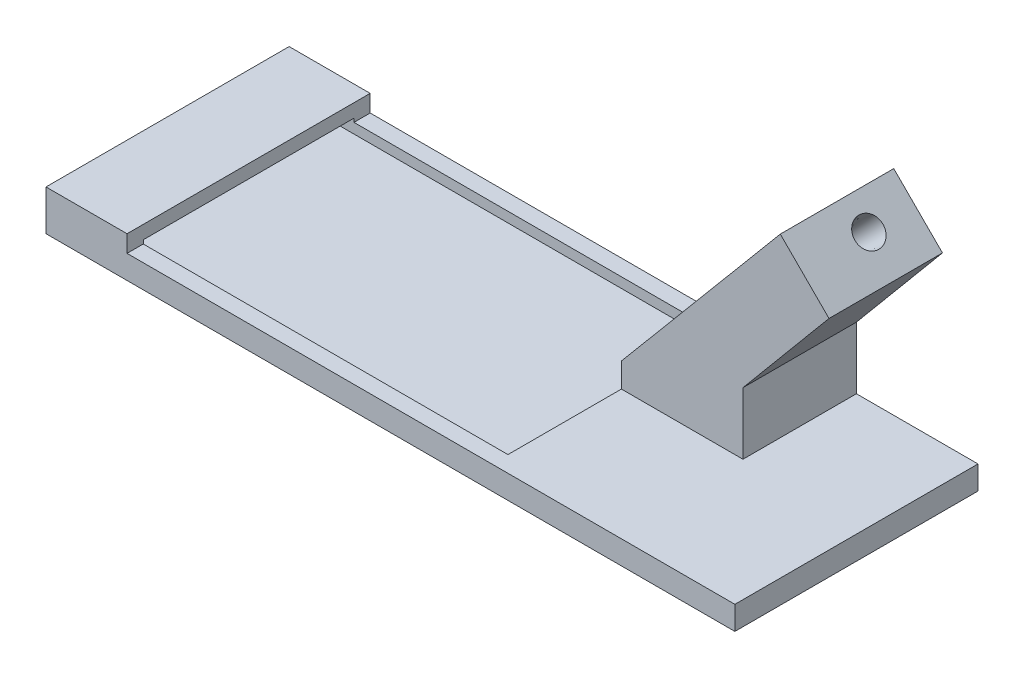
ISO-10303-21;
HEADER;
FILE_DESCRIPTION(('STEP AP214'),'2;1');
FILE_NAME('part.step','',(''),(''),'','','');
FILE_SCHEMA(('AUTOMOTIVE_DESIGN { 1 0 10303 214 1 1 1 1 }'));
ENDSEC;
DATA;
#1=APPLICATION_CONTEXT('core data for automotive mechanical design processes');
#2=APPLICATION_PROTOCOL_DEFINITION('international standard','automotive_design',2000,#1);
#3=PRODUCT_CONTEXT('',#1,'mechanical');
#4=PRODUCT('Part','Part','',(#3));
#5=PRODUCT_RELATED_PRODUCT_CATEGORY('part','',(#4));
#6=PRODUCT_DEFINITION_FORMATION('','',#4);
#7=PRODUCT_DEFINITION_CONTEXT('part definition',#1,'design');
#8=PRODUCT_DEFINITION('design','',#6,#7);
#9=PRODUCT_DEFINITION_SHAPE('','',#8);
#10=(LENGTH_UNIT() NAMED_UNIT(*) SI_UNIT(.MILLI.,.METRE.));
#11=(NAMED_UNIT(*) PLANE_ANGLE_UNIT() SI_UNIT($,.RADIAN.));
#12=(NAMED_UNIT(*) SI_UNIT($,.STERADIAN.) SOLID_ANGLE_UNIT());
#13=UNCERTAINTY_MEASURE_WITH_UNIT(LENGTH_MEASURE(1.E-05),#10,'distance_accuracy_value','');
#14=(GEOMETRIC_REPRESENTATION_CONTEXT(3) GLOBAL_UNCERTAINTY_ASSIGNED_CONTEXT((#13)) GLOBAL_UNIT_ASSIGNED_CONTEXT((#10,
#11,#12)) REPRESENTATION_CONTEXT('',''));
#15=CARTESIAN_POINT('',(0.,0.,0.));
#16=DIRECTION('',(0.,0.,1.));
#17=DIRECTION('',(1.,0.,0.));
#18=AXIS2_PLACEMENT_3D('',#15,#16,#17);
#19=CARTESIAN_POINT('',(0.,2.9,0.));
#20=DIRECTION('',(0.,-1.,0.));
#21=DIRECTION('',(0.,0.,-1.));
#22=AXIS2_PLACEMENT_3D('',#19,#20,#21);
#23=PLANE('',#22);
#24=DIRECTION('',(-1.,0.,0.));
#25=VECTOR('',#24,1.);
#26=CARTESIAN_POINT('',(12.5,2.9,-13.));
#27=LINE('',#26,#25);
#28=CARTESIAN_POINT('',(12.5,2.9,-13.));
#29=VERTEX_POINT('',#28);
#30=CARTESIAN_POINT('',(-32.5,2.9,-13.));
#31=VERTEX_POINT('',#30);
#32=EDGE_CURVE('E229',#29,#31,#27,.T.);
#33=ORIENTED_EDGE('',*,*,#32,.F.);
#34=DIRECTION('',(0.,0.,-1.));
#35=VECTOR('',#34,1.);
#36=CARTESIAN_POINT('',(12.5,2.9,0.));
#37=LINE('',#36,#35);
#38=CARTESIAN_POINT('',(12.5,2.9,-15.));
#39=VERTEX_POINT('',#38);
#40=EDGE_CURVE('E11',#29,#39,#37,.T.);
#41=ORIENTED_EDGE('',*,*,#40,.T.);
#42=DIRECTION('',(-1.,0.,0.));
#43=VECTOR('',#42,1.);
#44=CARTESIAN_POINT('',(42.5,2.9,-15.));
#45=LINE('',#44,#43);
#46=CARTESIAN_POINT('',(-32.5,2.9,-15.));
#47=VERTEX_POINT('',#46);
#48=EDGE_CURVE('E212',#39,#47,#45,.T.);
#49=ORIENTED_EDGE('',*,*,#48,.T.);
#50=DIRECTION('',(0.,0.,1.));
#51=VECTOR('',#50,1.);
#52=CARTESIAN_POINT('',(-32.5,2.9,-15.));
#53=LINE('',#52,#51);
#54=EDGE_CURVE('E215',#47,#31,#53,.T.);
#55=ORIENTED_EDGE('',*,*,#54,.T.);
#56=EDGE_LOOP('',(#33,#41,#49,#55));
#57=FACE_BOUND('',#56,.T.);
#58=ADVANCED_FACE('F32',(#57),#23,.F.);
#59=CARTESIAN_POINT('',(-42.5,5.,-15.));
#60=DIRECTION('',(1.,0.,0.));
#61=DIRECTION('',(0.,0.,-1.));
#62=AXIS2_PLACEMENT_3D('',#59,#60,#61);
#63=PLANE('',#62);
#64=DIRECTION('',(0.,0.,1.));
#65=VECTOR('',#64,1.);
#66=CARTESIAN_POINT('',(-42.5,1.65,13.));
#67=LINE('',#66,#65);
#68=CARTESIAN_POINT('',(-42.5,1.65,-13.));
#69=VERTEX_POINT('',#68);
#70=CARTESIAN_POINT('',(-42.5,1.65,13.));
#71=VERTEX_POINT('',#70);
#72=EDGE_CURVE('E250',#69,#71,#67,.T.);
#73=ORIENTED_EDGE('',*,*,#72,.F.);
#74=DIRECTION('',(0.,-1.,0.));
#75=VECTOR('',#74,1.);
#76=CARTESIAN_POINT('',(-42.5,3.35,-13.));
#77=LINE('',#76,#75);
#78=CARTESIAN_POINT('',(-42.5,3.35,-13.));
#79=VERTEX_POINT('',#78);
#80=EDGE_CURVE('E238',#79,#69,#77,.T.);
#81=ORIENTED_EDGE('',*,*,#80,.F.);
#82=DIRECTION('',(0.,0.,-1.));
#83=VECTOR('',#82,1.);
#84=CARTESIAN_POINT('',(-42.5,3.35,13.));
#85=LINE('',#84,#83);
#86=CARTESIAN_POINT('',(-42.5,3.35,13.));
#87=VERTEX_POINT('',#86);
#88=EDGE_CURVE('E242',#87,#79,#85,.T.);
#89=ORIENTED_EDGE('',*,*,#88,.F.);
#90=DIRECTION('',(0.,1.,0.));
#91=VECTOR('',#90,1.);
#92=CARTESIAN_POINT('',(-42.5,3.35,13.));
#93=LINE('',#92,#91);
#94=EDGE_CURVE('E253',#71,#87,#93,.T.);
#95=ORIENTED_EDGE('',*,*,#94,.F.);
#96=EDGE_LOOP('',(#73,#81,#89,#95));
#97=FACE_BOUND('',#96,.T.);
#98=DIRECTION('',(0.,0.,1.));
#99=VECTOR('',#98,1.);
#100=CARTESIAN_POINT('',(-42.5,0.,-15.));
#101=LINE('',#100,#99);
#102=CARTESIAN_POINT('',(-42.5,0.,-15.));
#103=VERTEX_POINT('',#102);
#104=CARTESIAN_POINT('',(-42.5,0.,15.));
#105=VERTEX_POINT('',#104);
#106=EDGE_CURVE('E260',#103,#105,#101,.T.);
#107=ORIENTED_EDGE('',*,*,#106,.T.);
#108=DIRECTION('',(0.,-1.,0.));
#109=VECTOR('',#108,1.);
#110=CARTESIAN_POINT('',(-42.5,5.,15.));
#111=LINE('',#110,#109);
#112=CARTESIAN_POINT('',(-42.5,5.,15.));
#113=VERTEX_POINT('',#112);
#114=EDGE_CURVE('E292',#113,#105,#111,.T.);
#115=ORIENTED_EDGE('',*,*,#114,.F.);
#116=DIRECTION('',(0.,0.,1.));
#117=VECTOR('',#116,1.);
#118=CARTESIAN_POINT('',(-42.5,5.,-15.));
#119=LINE('',#118,#117);
#120=CARTESIAN_POINT('',(-42.5,5.,-15.));
#121=VERTEX_POINT('',#120);
#122=EDGE_CURVE('E267',#121,#113,#119,.T.);
#123=ORIENTED_EDGE('',*,*,#122,.F.);
#124=DIRECTION('',(0.,-1.,0.));
#125=VECTOR('',#124,1.);
#126=CARTESIAN_POINT('',(-42.5,5.,-15.));
#127=LINE('',#126,#125);
#128=EDGE_CURVE('E276',#121,#103,#127,.T.);
#129=ORIENTED_EDGE('',*,*,#128,.T.);
#130=EDGE_LOOP('',(#107,#115,#123,#129));
#131=FACE_BOUND('',#130,.T.);
#132=ADVANCED_FACE('F34',(#97,#131),#63,.F.);
#133=CARTESIAN_POINT('',(42.5,5.,15.));
#134=DIRECTION('',(0.,0.,-1.));
#135=DIRECTION('',(-1.,0.,0.));
#136=AXIS2_PLACEMENT_3D('',#133,#134,#135);
#137=PLANE('',#136);
#138=DIRECTION('',(1.,0.,0.));
#139=VECTOR('',#138,1.);
#140=CARTESIAN_POINT('',(42.5,2.9,15.));
#141=LINE('',#140,#139);
#142=CARTESIAN_POINT('',(-32.5,2.9,15.));
#143=VERTEX_POINT('',#142);
#144=CARTESIAN_POINT('',(42.5,2.9,15.));
#145=VERTEX_POINT('',#144);
#146=EDGE_CURVE('E218',#143,#145,#141,.T.);
#147=ORIENTED_EDGE('',*,*,#146,.F.);
#148=DIRECTION('',(0.,1.,0.));
#149=VECTOR('',#148,1.);
#150=CARTESIAN_POINT('',(-32.5,2.9,15.));
#151=LINE('',#150,#149);
#152=CARTESIAN_POINT('',(-32.5,5.,15.));
#153=VERTEX_POINT('',#152);
#154=EDGE_CURVE('E222',#143,#153,#151,.T.);
#155=ORIENTED_EDGE('',*,*,#154,.T.);
#156=DIRECTION('',(1.,0.,0.));
#157=VECTOR('',#156,1.);
#158=CARTESIAN_POINT('',(42.5,5.,15.));
#159=LINE('',#158,#157);
#160=EDGE_CURVE('E270',#113,#153,#159,.T.);
#161=ORIENTED_EDGE('',*,*,#160,.F.);
#162=ORIENTED_EDGE('',*,*,#114,.T.);
#163=DIRECTION('',(1.,0.,0.));
#164=VECTOR('',#163,1.);
#165=CARTESIAN_POINT('',(42.5,0.,15.));
#166=LINE('',#165,#164);
#167=CARTESIAN_POINT('',(42.5,0.,15.));
#168=VERTEX_POINT('',#167);
#169=EDGE_CURVE('E279',#105,#168,#166,.T.);
#170=ORIENTED_EDGE('',*,*,#169,.T.);
#171=DIRECTION('',(0.,-1.,0.));
#172=VECTOR('',#171,1.);
#173=CARTESIAN_POINT('',(42.5,5.,15.));
#174=LINE('',#173,#172);
#175=EDGE_CURVE('E290',#145,#168,#174,.T.);
#176=ORIENTED_EDGE('',*,*,#175,.F.);
#177=EDGE_LOOP('',(#147,#155,#161,#162,#170,#176));
#178=FACE_BOUND('',#177,.T.);
#179=ADVANCED_FACE('F333',(#178),#137,.F.);
#180=CARTESIAN_POINT('',(42.5,5.,-15.));
#181=DIRECTION('',(-1.,0.,0.));
#182=DIRECTION('',(0.,0.,1.));
#183=AXIS2_PLACEMENT_3D('',#180,#181,#182);
#184=PLANE('',#183);
#185=DIRECTION('',(0.,-1.,0.));
#186=VECTOR('',#185,1.);
#187=CARTESIAN_POINT('',(42.5,5.,-15.));
#188=LINE('',#187,#186);
#189=CARTESIAN_POINT('',(42.5,2.9,-15.));
#190=VERTEX_POINT('',#189);
#191=CARTESIAN_POINT('',(42.5,0.,-15.));
#192=VERTEX_POINT('',#191);
#193=EDGE_CURVE('E288',#190,#192,#188,.T.);
#194=ORIENTED_EDGE('',*,*,#193,.F.);
#195=DIRECTION('',(0.,0.,-1.));
#196=VECTOR('',#195,1.);
#197=CARTESIAN_POINT('',(42.5,2.9,-15.));
#198=LINE('',#197,#196);
#199=EDGE_CURVE('E210',#145,#190,#198,.T.);
#200=ORIENTED_EDGE('',*,*,#199,.F.);
#201=ORIENTED_EDGE('',*,*,#175,.T.);
#202=DIRECTION('',(0.,0.,-1.));
#203=VECTOR('',#202,1.);
#204=CARTESIAN_POINT('',(42.5,0.,-15.));
#205=LINE('',#204,#203);
#206=EDGE_CURVE('E282',#168,#192,#205,.T.);
#207=ORIENTED_EDGE('',*,*,#206,.T.);
#208=EDGE_LOOP('',(#194,#200,#201,#207));
#209=FACE_BOUND('',#208,.T.);
#210=ADVANCED_FACE('F339',(#209),#184,.F.);
#211=CARTESIAN_POINT('',(42.5,5.,-15.));
#212=DIRECTION('',(0.,0.,1.));
#213=DIRECTION('',(1.,0.,0.));
#214=AXIS2_PLACEMENT_3D('',#211,#212,#213);
#215=PLANE('',#214);
#216=DIRECTION('',(-1.,0.,0.));
#217=VECTOR('',#216,1.);
#218=CARTESIAN_POINT('',(42.5,5.,-15.));
#219=LINE('',#218,#217);
#220=CARTESIAN_POINT('',(-32.5,5.,-15.));
#221=VERTEX_POINT('',#220);
#222=EDGE_CURVE('E274',#221,#121,#219,.T.);
#223=ORIENTED_EDGE('',*,*,#222,.F.);
#224=DIRECTION('',(0.,1.,0.));
#225=VECTOR('',#224,1.);
#226=CARTESIAN_POINT('',(-32.5,2.9,-15.));
#227=LINE('',#226,#225);
#228=EDGE_CURVE('E220',#47,#221,#227,.T.);
#229=ORIENTED_EDGE('',*,*,#228,.F.);
#230=ORIENTED_EDGE('',*,*,#48,.F.);
#231=DIRECTION('',(0.,1.,0.));
#232=VECTOR('',#231,1.);
#233=CARTESIAN_POINT('',(12.5,2.9,-15.));
#234=LINE('',#233,#232);
#235=CARTESIAN_POINT('',(12.5,5.9,-15.));
#236=VERTEX_POINT('',#235);
#237=EDGE_CURVE('E184',#39,#236,#234,.T.);
#238=ORIENTED_EDGE('',*,*,#237,.T.);
#239=DIRECTION('',(0.642787609686544,0.766044443118974,0.));
#240=VECTOR('',#239,1.);
#241=CARTESIAN_POINT('',(12.5,5.9,-15.));
#242=LINE('',#241,#240);
#243=CARTESIAN_POINT('',(32.1050220954396,29.2643555151287,-15.));
#244=VERTEX_POINT('',#243);
#245=EDGE_CURVE('E181',#236,#244,#242,.T.);
#246=ORIENTED_EDGE('',*,*,#245,.T.);
#247=DIRECTION('',(0.707106781186542,-0.707106781186553,0.));
#248=VECTOR('',#247,1.);
#249=CARTESIAN_POINT('',(32.1050220954396,29.2643555151287,-15.));
#250=LINE('',#249,#248);
#251=CARTESIAN_POINT('',(38.1154297355252,23.253947875043,-15.));
#252=VERTEX_POINT('',#251);
#253=EDGE_CURVE('E196',#244,#252,#250,.T.);
#254=ORIENTED_EDGE('',*,*,#253,.T.);
#255=DIRECTION('',(-0.641289531532385,-0.767298987844356,0.));
#256=VECTOR('',#255,1.);
#257=CARTESIAN_POINT('',(38.1154297355252,23.253947875043,-15.));
#258=LINE('',#257,#256);
#259=CARTESIAN_POINT('',(27.5,10.5526513605995,-15.));
#260=VERTEX_POINT('',#259);
#261=EDGE_CURVE('E161',#252,#260,#258,.T.);
#262=ORIENTED_EDGE('',*,*,#261,.T.);
#263=DIRECTION('',(0.,-1.,0.));
#264=VECTOR('',#263,1.);
#265=CARTESIAN_POINT('',(27.5,2.9,-15.));
#266=LINE('',#265,#264);
#267=CARTESIAN_POINT('',(27.5,2.9,-15.));
#268=VERTEX_POINT('',#267);
#269=EDGE_CURVE('E199',#260,#268,#266,.T.);
#270=ORIENTED_EDGE('',*,*,#269,.T.);
#271=EDGE_CURVE('E53',#190,#268,#45,.T.);
#272=ORIENTED_EDGE('',*,*,#271,.F.);
#273=ORIENTED_EDGE('',*,*,#193,.T.);
#274=DIRECTION('',(-1.,0.,0.));
#275=VECTOR('',#274,1.);
#276=CARTESIAN_POINT('',(42.5,0.,-15.));
#277=LINE('',#276,#275);
#278=EDGE_CURVE('E271',#192,#103,#277,.T.);
#279=ORIENTED_EDGE('',*,*,#278,.T.);
#280=ORIENTED_EDGE('',*,*,#128,.F.);
#281=EDGE_LOOP('',(#223,#229,#230,#238,#246,#254,#262,#270,#272,#273,#279,#280));
#282=FACE_BOUND('',#281,.T.);
#283=ADVANCED_FACE('F323',(#282),#215,.F.);
#284=CARTESIAN_POINT('',(0.,5.,0.));
#285=DIRECTION('',(0.,-1.,0.));
#286=DIRECTION('',(0.,0.,-1.));
#287=AXIS2_PLACEMENT_3D('',#284,#285,#286);
#288=PLANE('',#287);
#289=ORIENTED_EDGE('',*,*,#160,.T.);
#290=DIRECTION('',(0.,0.,1.));
#291=VECTOR('',#290,1.);
#292=CARTESIAN_POINT('',(-32.5,5.,-15.));
#293=LINE('',#292,#291);
#294=EDGE_CURVE('E205',#221,#153,#293,.T.);
#295=ORIENTED_EDGE('',*,*,#294,.F.);
#296=ORIENTED_EDGE('',*,*,#222,.T.);
#297=ORIENTED_EDGE('',*,*,#122,.T.);
#298=EDGE_LOOP('',(#289,#295,#296,#297));
#299=FACE_BOUND('',#298,.T.);
#300=ADVANCED_FACE('F328',(#299),#288,.F.);
#301=CARTESIAN_POINT('',(0.,0.,0.));
#302=DIRECTION('',(0.,-1.,0.));
#303=DIRECTION('',(0.,0.,-1.));
#304=AXIS2_PLACEMENT_3D('',#301,#302,#303);
#305=PLANE('',#304);
#306=ORIENTED_EDGE('',*,*,#106,.F.);
#307=ORIENTED_EDGE('',*,*,#278,.F.);
#308=ORIENTED_EDGE('',*,*,#206,.F.);
#309=ORIENTED_EDGE('',*,*,#169,.F.);
#310=EDGE_LOOP('',(#306,#307,#308,#309));
#311=FACE_BOUND('',#310,.T.);
#312=ADVANCED_FACE('F386',(#311),#305,.T.);
#313=CARTESIAN_POINT('',(12.5,3.35,-13.));
#314=DIRECTION('',(0.,0.,-1.));
#315=DIRECTION('',(-1.,0.,0.));
#316=AXIS2_PLACEMENT_3D('',#313,#314,#315);
#317=PLANE('',#316);
#318=ORIENTED_EDGE('',*,*,#32,.T.);
#319=DIRECTION('',(0.,1.,0.));
#320=VECTOR('',#319,1.);
#321=CARTESIAN_POINT('',(-32.5,3.35,-13.));
#322=LINE('',#321,#320);
#323=CARTESIAN_POINT('',(-32.5,3.35,-13.));
#324=VERTEX_POINT('',#323);
#325=EDGE_CURVE('E235',#31,#324,#322,.T.);
#326=ORIENTED_EDGE('',*,*,#325,.T.);
#327=DIRECTION('',(-1.,0.,0.));
#328=VECTOR('',#327,1.);
#329=CARTESIAN_POINT('',(12.5,3.35,-13.));
#330=LINE('',#329,#328);
#331=EDGE_CURVE('E258',#324,#79,#330,.T.);
#332=ORIENTED_EDGE('',*,*,#331,.T.);
#333=ORIENTED_EDGE('',*,*,#80,.T.);
#334=DIRECTION('',(-1.,0.,0.));
#335=VECTOR('',#334,1.);
#336=CARTESIAN_POINT('',(12.5,1.65,-13.));
#337=LINE('',#336,#335);
#338=CARTESIAN_POINT('',(12.5,1.65,-13.));
#339=VERTEX_POINT('',#338);
#340=EDGE_CURVE('E248',#339,#69,#337,.T.);
#341=ORIENTED_EDGE('',*,*,#340,.F.);
#342=DIRECTION('',(0.,-1.,0.));
#343=VECTOR('',#342,1.);
#344=CARTESIAN_POINT('',(12.5,3.35,-13.));
#345=LINE('',#344,#343);
#346=EDGE_CURVE('E239',#29,#339,#345,.T.);
#347=ORIENTED_EDGE('',*,*,#346,.F.);
#348=EDGE_LOOP('',(#318,#326,#332,#333,#341,#347));
#349=FACE_BOUND('',#348,.T.);
#350=ADVANCED_FACE('F314',(#349),#317,.F.);
#351=CARTESIAN_POINT('',(12.5,3.35,13.));
#352=DIRECTION('',(0.,1.,0.));
#353=DIRECTION('',(0.,0.,1.));
#354=AXIS2_PLACEMENT_3D('',#351,#352,#353);
#355=PLANE('',#354);
#356=ORIENTED_EDGE('',*,*,#331,.F.);
#357=DIRECTION('',(0.,0.,1.));
#358=VECTOR('',#357,1.);
#359=CARTESIAN_POINT('',(-32.5,3.35,13.));
#360=LINE('',#359,#358);
#361=CARTESIAN_POINT('',(-32.5,3.35,13.));
#362=VERTEX_POINT('',#361);
#363=EDGE_CURVE('E232',#324,#362,#360,.T.);
#364=ORIENTED_EDGE('',*,*,#363,.T.);
#365=DIRECTION('',(-1.,0.,0.));
#366=VECTOR('',#365,1.);
#367=CARTESIAN_POINT('',(12.5,3.35,13.));
#368=LINE('',#367,#366);
#369=EDGE_CURVE('E261',#362,#87,#368,.T.);
#370=ORIENTED_EDGE('',*,*,#369,.T.);
#371=ORIENTED_EDGE('',*,*,#88,.T.);
#372=EDGE_LOOP('',(#356,#364,#370,#371));
#373=FACE_BOUND('',#372,.T.);
#374=ADVANCED_FACE('F310',(#373),#355,.F.);
#375=CARTESIAN_POINT('',(12.5,3.35,13.));
#376=DIRECTION('',(0.,0.,1.));
#377=DIRECTION('',(1.,0.,0.));
#378=AXIS2_PLACEMENT_3D('',#375,#376,#377);
#379=PLANE('',#378);
#380=ORIENTED_EDGE('',*,*,#369,.F.);
#381=DIRECTION('',(0.,-1.,0.));
#382=VECTOR('',#381,1.);
#383=CARTESIAN_POINT('',(-32.5,3.35,13.));
#384=LINE('',#383,#382);
#385=CARTESIAN_POINT('',(-32.5,2.9,13.));
#386=VERTEX_POINT('',#385);
#387=EDGE_CURVE('E41',#362,#386,#384,.T.);
#388=ORIENTED_EDGE('',*,*,#387,.T.);
#389=DIRECTION('',(1.,0.,0.));
#390=VECTOR('',#389,1.);
#391=CARTESIAN_POINT('',(12.5,2.9,13.));
#392=LINE('',#391,#390);
#393=CARTESIAN_POINT('',(12.5,2.9,13.));
#394=VERTEX_POINT('',#393);
#395=EDGE_CURVE('E225',#386,#394,#392,.T.);
#396=ORIENTED_EDGE('',*,*,#395,.T.);
#397=DIRECTION('',(0.,1.,0.));
#398=VECTOR('',#397,1.);
#399=CARTESIAN_POINT('',(12.5,3.35,13.));
#400=LINE('',#399,#398);
#401=CARTESIAN_POINT('',(12.5,1.65,13.));
#402=VERTEX_POINT('',#401);
#403=EDGE_CURVE('E245',#402,#394,#400,.T.);
#404=ORIENTED_EDGE('',*,*,#403,.F.);
#405=DIRECTION('',(-1.,0.,0.));
#406=VECTOR('',#405,1.);
#407=CARTESIAN_POINT('',(12.5,1.65,13.));
#408=LINE('',#407,#406);
#409=EDGE_CURVE('E263',#402,#71,#408,.T.);
#410=ORIENTED_EDGE('',*,*,#409,.T.);
#411=ORIENTED_EDGE('',*,*,#94,.T.);
#412=EDGE_LOOP('',(#380,#388,#396,#404,#410,#411));
#413=FACE_BOUND('',#412,.T.);
#414=ADVANCED_FACE('F301',(#413),#379,.F.);
#415=CARTESIAN_POINT('',(12.5,1.65,13.));
#416=DIRECTION('',(0.,-1.,0.));
#417=DIRECTION('',(0.,0.,-1.));
#418=AXIS2_PLACEMENT_3D('',#415,#416,#417);
#419=PLANE('',#418);
#420=ORIENTED_EDGE('',*,*,#72,.T.);
#421=ORIENTED_EDGE('',*,*,#409,.F.);
#422=DIRECTION('',(0.,0.,1.));
#423=VECTOR('',#422,1.);
#424=CARTESIAN_POINT('',(12.5,1.65,13.));
#425=LINE('',#424,#423);
#426=EDGE_CURVE('E241',#339,#402,#425,.T.);
#427=ORIENTED_EDGE('',*,*,#426,.F.);
#428=ORIENTED_EDGE('',*,*,#340,.T.);
#429=EDGE_LOOP('',(#420,#421,#427,#428));
#430=FACE_BOUND('',#429,.T.);
#431=ADVANCED_FACE('F373',(#430),#419,.F.);
#432=CARTESIAN_POINT('',(12.5,0.,0.));
#433=DIRECTION('',(1.,0.,0.));
#434=DIRECTION('',(0.,0.,-1.));
#435=AXIS2_PLACEMENT_3D('',#432,#433,#434);
#436=PLANE('',#435);
#437=CARTESIAN_POINT('',(12.5,4.43197982829525,-9.20586955342873));
#438=DIRECTION('',(1.,0.,0.));
#439=DIRECTION('',(0.,0.999991298408043,-0.00417170327266018));
#440=AXIS2_PLACEMENT_3D('',#437,#438,#439);
#441=ELLIPSE('',#440,0.94280815882055,0.666279510135949);
#442=CARTESIAN_POINT('',(12.5,5.37477978318391,-9.20980266931037));
#443=VERTEX_POINT('',#442);
#444=EDGE_CURVE('E187',#443,#443,#441,.F.);
#445=ORIENTED_EDGE('',*,*,#444,.F.);
#446=EDGE_LOOP('',(#445));
#447=FACE_BOUND('',#446,.T.);
#448=ORIENTED_EDGE('',*,*,#403,.T.);
#449=DIRECTION('',(0.,0.,-1.));
#450=VECTOR('',#449,1.);
#451=CARTESIAN_POINT('',(12.5,2.9,0.));
#452=LINE('',#451,#450);
#453=CARTESIAN_POINT('',(12.5,2.9,-0.999999999999995));
#454=VERTEX_POINT('',#453);
#455=EDGE_CURVE('E295',#394,#454,#452,.T.);
#456=ORIENTED_EDGE('',*,*,#455,.T.);
#457=DIRECTION('',(0.,1.,0.));
#458=VECTOR('',#457,1.);
#459=CARTESIAN_POINT('',(12.5,2.9,-0.999999999999992));
#460=LINE('',#459,#458);
#461=CARTESIAN_POINT('',(12.5,5.9,-0.999999999999992));
#462=VERTEX_POINT('',#461);
#463=EDGE_CURVE('E192',#454,#462,#460,.T.);
#464=ORIENTED_EDGE('',*,*,#463,.T.);
#465=DIRECTION('',(0.,0.,-1.));
#466=VECTOR('',#465,1.);
#467=CARTESIAN_POINT('',(12.5,5.9,-0.999999999999992));
#468=LINE('',#467,#466);
#469=EDGE_CURVE('E206',#462,#236,#468,.T.);
#470=ORIENTED_EDGE('',*,*,#469,.T.);
#471=ORIENTED_EDGE('',*,*,#237,.F.);
#472=ORIENTED_EDGE('',*,*,#40,.F.);
#473=ORIENTED_EDGE('',*,*,#346,.T.);
#474=ORIENTED_EDGE('',*,*,#426,.T.);
#475=EDGE_LOOP('',(#448,#456,#464,#470,#471,#472,#473,#474));
#476=FACE_BOUND('',#475,.T.);
#477=ADVANCED_FACE('F369',(#447,#476),#436,.F.);
#478=CARTESIAN_POINT('',(-32.5,2.9,-15.));
#479=DIRECTION('',(-1.,0.,0.));
#480=DIRECTION('',(0.,0.,1.));
#481=AXIS2_PLACEMENT_3D('',#478,#479,#480);
#482=PLANE('',#481);
#483=ORIENTED_EDGE('',*,*,#54,.F.);
#484=ORIENTED_EDGE('',*,*,#228,.T.);
#485=ORIENTED_EDGE('',*,*,#294,.T.);
#486=ORIENTED_EDGE('',*,*,#154,.F.);
#487=EDGE_CURVE('E214',#386,#143,#53,.T.);
#488=ORIENTED_EDGE('',*,*,#487,.F.);
#489=ORIENTED_EDGE('',*,*,#387,.F.);
#490=ORIENTED_EDGE('',*,*,#363,.F.);
#491=ORIENTED_EDGE('',*,*,#325,.F.);
#492=EDGE_LOOP('',(#483,#484,#485,#486,#488,#489,#490,#491));
#493=FACE_BOUND('',#492,.T.);
#494=ADVANCED_FACE('F306',(#493),#482,.F.);
#495=ORIENTED_EDGE('',*,*,#271,.T.);
#496=DIRECTION('',(0.,0.,-1.));
#497=VECTOR('',#496,1.);
#498=CARTESIAN_POINT('',(27.5,2.9,-0.999999999999994));
#499=LINE('',#498,#497);
#500=CARTESIAN_POINT('',(27.5,2.9,-0.999999999999996));
#501=VERTEX_POINT('',#500);
#502=EDGE_CURVE('E48',#501,#268,#499,.T.);
#503=ORIENTED_EDGE('',*,*,#502,.F.);
#504=DIRECTION('',(-1.,0.,0.));
#505=VECTOR('',#504,1.);
#506=CARTESIAN_POINT('',(27.5,2.9,-0.999999999999994));
#507=LINE('',#506,#505);
#508=EDGE_CURVE('E190',#501,#454,#507,.T.);
#509=ORIENTED_EDGE('',*,*,#508,.T.);
#510=ORIENTED_EDGE('',*,*,#455,.F.);
#511=ORIENTED_EDGE('',*,*,#395,.F.);
#512=ORIENTED_EDGE('',*,*,#487,.T.);
#513=ORIENTED_EDGE('',*,*,#146,.T.);
#514=ORIENTED_EDGE('',*,*,#199,.T.);
#515=EDGE_LOOP('',(#495,#503,#509,#510,#511,#512,#513,#514));
#516=FACE_BOUND('',#515,.T.);
#517=ADVANCED_FACE('F336',(#516),#23,.F.);
#518=CARTESIAN_POINT('',(32.1050220954396,29.2643555151287,-0.999999999999994));
#519=DIRECTION('',(0.707106781186553,0.707106781186542,0.));
#520=DIRECTION('',(-0.707106781186542,0.707106781186553,0.));
#521=AXIS2_PLACEMENT_3D('',#518,#519,#520);
#522=PLANE('',#521);
#523=CARTESIAN_POINT('',(34.7346888052843,26.634688805284,-9.29866682501442));
#524=DIRECTION('',(0.707106781186553,0.707106781186542,0.));
#525=DIRECTION('',(-5.58935636202951E-13,5.58813185134068E-13,-1.));
#526=AXIS2_PLACEMENT_3D('',#523,#524,#525);
#527=ELLIPSE('',#526,1.7325015888044,1.73249404232161);
#528=CARTESIAN_POINT('',(34.7346888052833,26.634688805285,-11.0311684138188));
#529=VERTEX_POINT('',#528);
#530=EDGE_CURVE('E36',#529,#529,#527,.F.);
#531=ORIENTED_EDGE('',*,*,#530,.T.);
#532=EDGE_LOOP('',(#531));
#533=FACE_BOUND('',#532,.T.);
#534=ORIENTED_EDGE('',*,*,#253,.F.);
#535=DIRECTION('',(0.,0.,-1.));
#536=VECTOR('',#535,1.);
#537=CARTESIAN_POINT('',(32.1050220954396,29.2643555151287,-0.999999999999994));
#538=LINE('',#537,#536);
#539=CARTESIAN_POINT('',(32.1050220954396,29.2643555151287,-0.999999999999994));
#540=VERTEX_POINT('',#539);
#541=EDGE_CURVE('E180',#540,#244,#538,.T.);
#542=ORIENTED_EDGE('',*,*,#541,.F.);
#543=DIRECTION('',(0.707106781186542,-0.707106781186553,0.));
#544=VECTOR('',#543,1.);
#545=CARTESIAN_POINT('',(32.1050220954396,29.2643555151287,-0.999999999999994));
#546=LINE('',#545,#544);
#547=CARTESIAN_POINT('',(38.1154297355252,23.253947875043,-0.999999999999996));
#548=VERTEX_POINT('',#547);
#549=EDGE_CURVE('E174',#540,#548,#546,.T.);
#550=ORIENTED_EDGE('',*,*,#549,.T.);
#551=DIRECTION('',(0.,0.,-1.));
#552=VECTOR('',#551,1.);
#553=CARTESIAN_POINT('',(38.1154297355252,23.253947875043,-0.999999999999996));
#554=LINE('',#553,#552);
#555=EDGE_CURVE('E156',#548,#252,#554,.T.);
#556=ORIENTED_EDGE('',*,*,#555,.T.);
#557=EDGE_LOOP('',(#534,#542,#550,#556));
#558=FACE_BOUND('',#557,.T.);
#559=ADVANCED_FACE('F179',(#533,#558),#522,.T.);
#560=CARTESIAN_POINT('',(12.5,5.9,-0.999999999999992));
#561=DIRECTION('',(-0.766044443118974,0.642787609686544,0.));
#562=DIRECTION('',(-0.642787609686544,-0.766044443118974,0.));
#563=AXIS2_PLACEMENT_3D('',#560,#561,#562);
#564=PLANE('',#563);
#565=ORIENTED_EDGE('',*,*,#245,.F.);
#566=ORIENTED_EDGE('',*,*,#469,.F.);
#567=DIRECTION('',(0.642787609686544,0.766044443118974,0.));
#568=VECTOR('',#567,1.);
#569=CARTESIAN_POINT('',(12.5,5.9,-0.999999999999992));
#570=LINE('',#569,#568);
#571=EDGE_CURVE('E167',#462,#540,#570,.T.);
#572=ORIENTED_EDGE('',*,*,#571,.T.);
#573=ORIENTED_EDGE('',*,*,#541,.T.);
#574=EDGE_LOOP('',(#565,#566,#572,#573));
#575=FACE_BOUND('',#574,.T.);
#576=ADVANCED_FACE('F346',(#575),#564,.T.);
#577=CARTESIAN_POINT('',(27.5,2.9,-0.999999999999994));
#578=DIRECTION('',(1.,0.,0.));
#579=DIRECTION('',(0.,0.,-1.));
#580=AXIS2_PLACEMENT_3D('',#577,#578,#579);
#581=PLANE('',#580);
#582=ORIENTED_EDGE('',*,*,#269,.F.);
#583=DIRECTION('',(0.,0.,-1.));
#584=VECTOR('',#583,1.);
#585=CARTESIAN_POINT('',(27.5,10.5526513605995,-0.999999999999994));
#586=LINE('',#585,#584);
#587=CARTESIAN_POINT('',(27.5,10.5526513605995,-0.999999999999994));
#588=VERTEX_POINT('',#587);
#589=EDGE_CURVE('E166',#588,#260,#586,.T.);
#590=ORIENTED_EDGE('',*,*,#589,.F.);
#591=DIRECTION('',(0.,-1.,0.));
#592=VECTOR('',#591,1.);
#593=CARTESIAN_POINT('',(27.5,2.9,-0.999999999999994));
#594=LINE('',#593,#592);
#595=EDGE_CURVE('E177',#588,#501,#594,.T.);
#596=ORIENTED_EDGE('',*,*,#595,.T.);
#597=ORIENTED_EDGE('',*,*,#502,.T.);
#598=EDGE_LOOP('',(#582,#590,#596,#597));
#599=FACE_BOUND('',#598,.T.);
#600=ADVANCED_FACE('F344',(#599),#581,.T.);
#601=CARTESIAN_POINT('',(38.1154297355252,23.253947875043,-0.999999999999996));
#602=DIRECTION('',(0.767298987844356,-0.641289531532386,0.));
#603=DIRECTION('',(0.641289531532386,0.767298987844356,0.));
#604=AXIS2_PLACEMENT_3D('',#601,#602,#603);
#605=PLANE('',#604);
#606=ORIENTED_EDGE('',*,*,#261,.F.);
#607=ORIENTED_EDGE('',*,*,#555,.F.);
#608=DIRECTION('',(-0.641289531532385,-0.767298987844356,0.));
#609=VECTOR('',#608,1.);
#610=CARTESIAN_POINT('',(38.1154297355252,23.253947875043,-0.999999999999996));
#611=LINE('',#610,#609);
#612=EDGE_CURVE('E159',#548,#588,#611,.T.);
#613=ORIENTED_EDGE('',*,*,#612,.T.);
#614=ORIENTED_EDGE('',*,*,#589,.T.);
#615=EDGE_LOOP('',(#606,#607,#613,#614));
#616=FACE_BOUND('',#615,.T.);
#617=ADVANCED_FACE('F158',(#616),#605,.T.);
#618=CARTESIAN_POINT('',(0.,0.,-0.99999999999999));
#619=DIRECTION('',(0.,0.,1.));
#620=DIRECTION('',(1.,0.,0.));
#621=AXIS2_PLACEMENT_3D('',#618,#619,#620);
#622=PLANE('',#621);
#623=ORIENTED_EDGE('',*,*,#549,.F.);
#624=ORIENTED_EDGE('',*,*,#571,.F.);
#625=ORIENTED_EDGE('',*,*,#463,.F.);
#626=ORIENTED_EDGE('',*,*,#508,.F.);
#627=ORIENTED_EDGE('',*,*,#595,.F.);
#628=ORIENTED_EDGE('',*,*,#612,.F.);
#629=EDGE_LOOP('',(#623,#624,#625,#626,#627,#628));
#630=FACE_BOUND('',#629,.T.);
#631=ADVANCED_FACE('F172',(#630),#622,.T.);
#632=CARTESIAN_POINT('',(35.0994658293251,26.9994658293248,-9.30001522785218));
#633=DIRECTION('',(0.707103704689134,0.707103704689126,-0.00294985250737461));
#634=DIRECTION('',(-0.707106781186543,0.707106781186552,0.));
#635=AXIS2_PLACEMENT_3D('',#632,#633,#634);
#636=CONICAL_SURFACE('',#635,1.74999238605735,0.0339067621086748);
#637=ORIENTED_EDGE('',*,*,#530,.F.);
#638=EDGE_LOOP('',(#637));
#639=FACE_BOUND('',#638,.T.);
#640=ORIENTED_EDGE('',*,*,#444,.T.);
#641=EDGE_LOOP('',(#640));
#642=FACE_BOUND('',#641,.T.);
#643=ADVANCED_FACE('F454',(#639,#642),#636,.F.);
#644=CLOSED_SHELL('',(#58,#132,#179,#210,#283,#300,#312,#350,#374,#414,#431,#477,#494,#517,#559,
#576,#600,#617,#631,#643));
#645=MANIFOLD_SOLID_BREP('B2',#644);
#646=ADVANCED_BREP_SHAPE_REPRESENTATION('',(#18,#645),#14);
#647=SHAPE_DEFINITION_REPRESENTATION(#9,#646);
ENDSEC;
END-ISO-10303-21;
